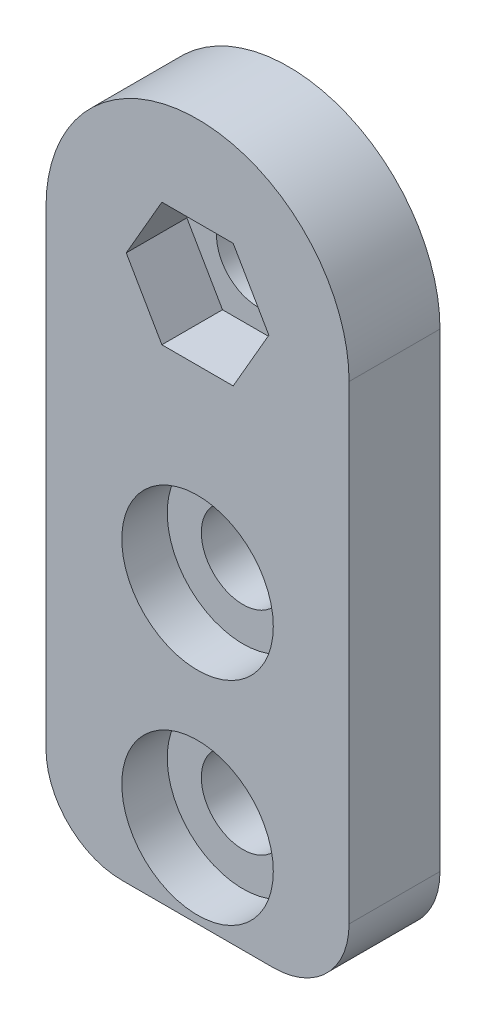
ISO-10303-21;
HEADER;
FILE_DESCRIPTION(('STEP AP214'),'2;1');
FILE_NAME('part.step','',(''),(''),'','','');
FILE_SCHEMA(('AUTOMOTIVE_DESIGN { 1 0 10303 214 1 1 1 1 }'));
ENDSEC;
DATA;
#1=APPLICATION_CONTEXT('core data for automotive mechanical design processes');
#2=APPLICATION_PROTOCOL_DEFINITION('international standard','automotive_design',2000,#1);
#3=PRODUCT_CONTEXT('',#1,'mechanical');
#4=PRODUCT('Part','Part','',(#3));
#5=PRODUCT_RELATED_PRODUCT_CATEGORY('part','',(#4));
#6=PRODUCT_DEFINITION_FORMATION('','',#4);
#7=PRODUCT_DEFINITION_CONTEXT('part definition',#1,'design');
#8=PRODUCT_DEFINITION('design','',#6,#7);
#9=PRODUCT_DEFINITION_SHAPE('','',#8);
#10=(LENGTH_UNIT() NAMED_UNIT(*) SI_UNIT(.MILLI.,.METRE.));
#11=(NAMED_UNIT(*) PLANE_ANGLE_UNIT() SI_UNIT($,.RADIAN.));
#12=(NAMED_UNIT(*) SI_UNIT($,.STERADIAN.) SOLID_ANGLE_UNIT());
#13=UNCERTAINTY_MEASURE_WITH_UNIT(LENGTH_MEASURE(1.E-05),#10,'distance_accuracy_value','');
#14=(GEOMETRIC_REPRESENTATION_CONTEXT(3) GLOBAL_UNCERTAINTY_ASSIGNED_CONTEXT((#13)) GLOBAL_UNIT_ASSIGNED_CONTEXT((#10,
#11,#12)) REPRESENTATION_CONTEXT('',''));
#15=CARTESIAN_POINT('',(0.,0.,0.));
#16=DIRECTION('',(0.,0.,1.));
#17=DIRECTION('',(1.,0.,0.));
#18=AXIS2_PLACEMENT_3D('',#15,#16,#17);
#19=CARTESIAN_POINT('',(0.,18.,6.));
#20=DIRECTION('',(0.,0.,-1.));
#21=DIRECTION('',(-1.,0.,0.));
#22=AXIS2_PLACEMENT_3D('',#19,#20,#21);
#23=CYLINDRICAL_SURFACE('',#22,2.75);
#24=CARTESIAN_POINT('',(0.,18.,0.));
#25=DIRECTION('',(0.,0.,1.));
#26=DIRECTION('',(1.,0.,0.));
#27=AXIS2_PLACEMENT_3D('',#24,#25,#26);
#28=CIRCLE('',#27,2.75);
#29=CARTESIAN_POINT('',(2.75,18.,0.));
#30=VERTEX_POINT('',#29);
#31=EDGE_CURVE('E191',#30,#30,#28,.T.);
#32=ORIENTED_EDGE('',*,*,#31,.F.);
#33=EDGE_LOOP('',(#32));
#34=FACE_BOUND('',#33,.T.);
#35=CARTESIAN_POINT('',(0.,18.,2.));
#36=DIRECTION('',(0.,0.,1.));
#37=DIRECTION('',(1.,0.,0.));
#38=AXIS2_PLACEMENT_3D('',#35,#36,#37);
#39=CIRCLE('',#38,2.75);
#40=CARTESIAN_POINT('',(2.75,18.,2.));
#41=VERTEX_POINT('',#40);
#42=EDGE_CURVE('E37',#41,#41,#39,.T.);
#43=ORIENTED_EDGE('',*,*,#42,.T.);
#44=EDGE_LOOP('',(#43));
#45=FACE_BOUND('',#44,.T.);
#46=ADVANCED_FACE('F33',(#34,#45),#23,.F.);
#47=CARTESIAN_POINT('',(0.,1.5,6.));
#48=DIRECTION('',(0.,0.,-1.));
#49=DIRECTION('',(-1.,0.,0.));
#50=AXIS2_PLACEMENT_3D('',#47,#48,#49);
#51=CYLINDRICAL_SURFACE('',#50,2.75);
#52=CARTESIAN_POINT('',(0.,1.5,0.));
#53=DIRECTION('',(0.,0.,1.));
#54=DIRECTION('',(1.,0.,0.));
#55=AXIS2_PLACEMENT_3D('',#52,#53,#54);
#56=CIRCLE('',#55,2.75);
#57=CARTESIAN_POINT('',(2.75,1.5,0.));
#58=VERTEX_POINT('',#57);
#59=EDGE_CURVE('E198',#58,#58,#56,.T.);
#60=ORIENTED_EDGE('',*,*,#59,.F.);
#61=EDGE_LOOP('',(#60));
#62=FACE_BOUND('',#61,.T.);
#63=CARTESIAN_POINT('',(0.,1.5,3.));
#64=DIRECTION('',(0.,0.,1.));
#65=DIRECTION('',(1.,0.,0.));
#66=AXIS2_PLACEMENT_3D('',#63,#64,#65);
#67=CIRCLE('',#66,2.75);
#68=CARTESIAN_POINT('',(2.75,1.5,3.));
#69=VERTEX_POINT('',#68);
#70=EDGE_CURVE('E195',#69,#69,#67,.T.);
#71=ORIENTED_EDGE('',*,*,#70,.T.);
#72=EDGE_LOOP('',(#71));
#73=FACE_BOUND('',#72,.T.);
#74=ADVANCED_FACE('F280',(#62,#73),#51,.F.);
#75=CARTESIAN_POINT('',(0.,-12.5,6.));
#76=DIRECTION('',(0.,0.,-1.));
#77=DIRECTION('',(-1.,0.,0.));
#78=AXIS2_PLACEMENT_3D('',#75,#76,#77);
#79=CYLINDRICAL_SURFACE('',#78,2.75);
#80=CARTESIAN_POINT('',(0.,-12.5,0.));
#81=DIRECTION('',(0.,0.,1.));
#82=DIRECTION('',(1.,0.,0.));
#83=AXIS2_PLACEMENT_3D('',#80,#81,#82);
#84=CIRCLE('',#83,2.75);
#85=CARTESIAN_POINT('',(2.75,-12.5,0.));
#86=VERTEX_POINT('',#85);
#87=EDGE_CURVE('E194',#86,#86,#84,.T.);
#88=ORIENTED_EDGE('',*,*,#87,.F.);
#89=EDGE_LOOP('',(#88));
#90=FACE_BOUND('',#89,.T.);
#91=CARTESIAN_POINT('',(0.,-12.5,3.));
#92=DIRECTION('',(0.,0.,1.));
#93=DIRECTION('',(1.,0.,0.));
#94=AXIS2_PLACEMENT_3D('',#91,#92,#93);
#95=CIRCLE('',#94,2.75);
#96=CARTESIAN_POINT('',(2.75,-12.5,3.));
#97=VERTEX_POINT('',#96);
#98=EDGE_CURVE('E181',#97,#97,#95,.T.);
#99=ORIENTED_EDGE('',*,*,#98,.T.);
#100=EDGE_LOOP('',(#99));
#101=FACE_BOUND('',#100,.T.);
#102=ADVANCED_FACE('F286',(#90,#101),#79,.F.);
#103=CARTESIAN_POINT('',(0.,18.,6.));
#104=DIRECTION('',(0.,0.,-1.));
#105=DIRECTION('',(-1.,0.,0.));
#106=AXIS2_PLACEMENT_3D('',#103,#104,#105);
#107=PLANE('',#106);
#108=DIRECTION('',(0.5,0.866025403784439,0.));
#109=VECTOR('',#108,1.);
#110=CARTESIAN_POINT('',(2.35270234694773,13.925,6.));
#111=LINE('',#110,#109);
#112=CARTESIAN_POINT('',(2.35270234694773,13.925,6.));
#113=VERTEX_POINT('',#112);
#114=CARTESIAN_POINT('',(4.70540469389545,18.,6.));
#115=VERTEX_POINT('',#114);
#116=EDGE_CURVE('E159',#113,#115,#111,.T.);
#117=ORIENTED_EDGE('',*,*,#116,.F.);
#118=DIRECTION('',(1.,0.,0.));
#119=VECTOR('',#118,1.);
#120=CARTESIAN_POINT('',(-2.35270234694773,13.925,6.));
#121=LINE('',#120,#119);
#122=CARTESIAN_POINT('',(-2.35270234694773,13.925,6.));
#123=VERTEX_POINT('',#122);
#124=EDGE_CURVE('E49',#123,#113,#121,.T.);
#125=ORIENTED_EDGE('',*,*,#124,.F.);
#126=DIRECTION('',(0.499999999999999,-0.866025403784439,0.));
#127=VECTOR('',#126,1.);
#128=CARTESIAN_POINT('',(-4.70540469389546,18.,6.));
#129=LINE('',#128,#127);
#130=CARTESIAN_POINT('',(-4.70540469389546,18.,6.));
#131=VERTEX_POINT('',#130);
#132=EDGE_CURVE('E145',#131,#123,#129,.T.);
#133=ORIENTED_EDGE('',*,*,#132,.F.);
#134=DIRECTION('',(-0.5,-0.866025403784438,0.));
#135=VECTOR('',#134,1.);
#136=CARTESIAN_POINT('',(-2.35270234694773,22.075,6.));
#137=LINE('',#136,#135);
#138=CARTESIAN_POINT('',(-2.35270234694773,22.075,6.));
#139=VERTEX_POINT('',#138);
#140=EDGE_CURVE('E148',#139,#131,#137,.T.);
#141=ORIENTED_EDGE('',*,*,#140,.F.);
#142=DIRECTION('',(-1.,0.,0.));
#143=VECTOR('',#142,1.);
#144=CARTESIAN_POINT('',(2.35270234694773,22.075,6.));
#145=LINE('',#144,#143);
#146=CARTESIAN_POINT('',(2.35270234694773,22.075,6.));
#147=VERTEX_POINT('',#146);
#148=EDGE_CURVE('E164',#147,#139,#145,.T.);
#149=ORIENTED_EDGE('',*,*,#148,.F.);
#150=DIRECTION('',(-0.5,0.866025403784439,0.));
#151=VECTOR('',#150,1.);
#152=CARTESIAN_POINT('',(4.70540469389545,18.,6.));
#153=LINE('',#152,#151);
#154=EDGE_CURVE('E161',#115,#147,#153,.T.);
#155=ORIENTED_EDGE('',*,*,#154,.F.);
#156=EDGE_LOOP('',(#117,#125,#133,#141,#149,#155));
#157=FACE_BOUND('',#156,.T.);
#158=CARTESIAN_POINT('',(0.,1.5,6.));
#159=DIRECTION('',(0.,0.,1.));
#160=DIRECTION('',(1.,0.,0.));
#161=AXIS2_PLACEMENT_3D('',#158,#159,#160);
#162=CIRCLE('',#161,5.);
#163=CARTESIAN_POINT('',(5.,1.5,6.));
#164=VERTEX_POINT('',#163);
#165=EDGE_CURVE('E182',#164,#164,#162,.T.);
#166=ORIENTED_EDGE('',*,*,#165,.F.);
#167=EDGE_LOOP('',(#166));
#168=FACE_BOUND('',#167,.T.);
#169=CARTESIAN_POINT('',(0.,-12.5,6.));
#170=DIRECTION('',(0.,0.,1.));
#171=DIRECTION('',(1.,0.,0.));
#172=AXIS2_PLACEMENT_3D('',#169,#170,#171);
#173=CIRCLE('',#172,5.);
#174=CARTESIAN_POINT('',(5.,-12.5,6.));
#175=VERTEX_POINT('',#174);
#176=EDGE_CURVE('E188',#175,#175,#173,.T.);
#177=ORIENTED_EDGE('',*,*,#176,.F.);
#178=EDGE_LOOP('',(#177));
#179=FACE_BOUND('',#178,.T.);
#180=DIRECTION('',(0.,-1.,0.));
#181=VECTOR('',#180,1.);
#182=CARTESIAN_POINT('',(-10.,18.,6.));
#183=LINE('',#182,#181);
#184=CARTESIAN_POINT('',(-10.,18.,6.));
#185=VERTEX_POINT('',#184);
#186=CARTESIAN_POINT('',(-9.99999999999999,-13.,6.));
#187=VERTEX_POINT('',#186);
#188=EDGE_CURVE('E202',#185,#187,#183,.T.);
#189=ORIENTED_EDGE('',*,*,#188,.T.);
#190=CARTESIAN_POINT('',(-4.99999999999999,-13.,6.));
#191=DIRECTION('',(0.,0.,-1.));
#192=DIRECTION('',(-1.,0.,0.));
#193=AXIS2_PLACEMENT_3D('',#190,#191,#192);
#194=CIRCLE('',#193,5.);
#195=CARTESIAN_POINT('',(-4.99999999999999,-18.,6.));
#196=VERTEX_POINT('',#195);
#197=EDGE_CURVE('E42',#187,#196,#194,.F.);
#198=ORIENTED_EDGE('',*,*,#197,.T.);
#199=DIRECTION('',(1.,0.,0.));
#200=VECTOR('',#199,1.);
#201=CARTESIAN_POINT('',(10.,-18.,6.));
#202=LINE('',#201,#200);
#203=CARTESIAN_POINT('',(5.,-18.,6.));
#204=VERTEX_POINT('',#203);
#205=EDGE_CURVE('E205',#196,#204,#202,.T.);
#206=ORIENTED_EDGE('',*,*,#205,.T.);
#207=CARTESIAN_POINT('',(5.,-13.,6.));
#208=DIRECTION('',(0.,0.,-1.));
#209=DIRECTION('',(-1.,0.,0.));
#210=AXIS2_PLACEMENT_3D('',#207,#208,#209);
#211=CIRCLE('',#210,5.);
#212=CARTESIAN_POINT('',(10.,-13.,6.));
#213=VERTEX_POINT('',#212);
#214=EDGE_CURVE('E57',#204,#213,#211,.F.);
#215=ORIENTED_EDGE('',*,*,#214,.T.);
#216=DIRECTION('',(0.,1.,0.));
#217=VECTOR('',#216,1.);
#218=CARTESIAN_POINT('',(10.,18.,6.));
#219=LINE('',#218,#217);
#220=CARTESIAN_POINT('',(10.,18.,6.));
#221=VERTEX_POINT('',#220);
#222=EDGE_CURVE('E208',#213,#221,#219,.T.);
#223=ORIENTED_EDGE('',*,*,#222,.T.);
#224=CARTESIAN_POINT('',(0.,18.,6.));
#225=DIRECTION('',(0.,0.,1.));
#226=DIRECTION('',(-1.,0.,0.));
#227=AXIS2_PLACEMENT_3D('',#224,#225,#226);
#228=CIRCLE('',#227,10.);
#229=EDGE_CURVE('E210',#221,#185,#228,.T.);
#230=ORIENTED_EDGE('',*,*,#229,.T.);
#231=EDGE_LOOP('',(#189,#198,#206,#215,#223,#230));
#232=FACE_BOUND('',#231,.T.);
#233=ADVANCED_FACE('F244',(#157,#168,#179,#232),#107,.F.);
#234=CARTESIAN_POINT('',(0.,18.,0.));
#235=DIRECTION('',(0.,0.,-1.));
#236=DIRECTION('',(-1.,0.,0.));
#237=AXIS2_PLACEMENT_3D('',#234,#235,#236);
#238=PLANE('',#237);
#239=ORIENTED_EDGE('',*,*,#87,.T.);
#240=EDGE_LOOP('',(#239));
#241=FACE_BOUND('',#240,.T.);
#242=DIRECTION('',(1.,0.,0.));
#243=VECTOR('',#242,1.);
#244=CARTESIAN_POINT('',(10.,-18.,0.));
#245=LINE('',#244,#243);
#246=CARTESIAN_POINT('',(-4.99999999999999,-18.,0.));
#247=VERTEX_POINT('',#246);
#248=CARTESIAN_POINT('',(5.,-18.,0.));
#249=VERTEX_POINT('',#248);
#250=EDGE_CURVE('E215',#247,#249,#245,.T.);
#251=ORIENTED_EDGE('',*,*,#250,.F.);
#252=CARTESIAN_POINT('',(-4.99999999999999,-13.,0.));
#253=DIRECTION('',(0.,0.,-1.));
#254=DIRECTION('',(-1.,0.,0.));
#255=AXIS2_PLACEMENT_3D('',#252,#253,#254);
#256=CIRCLE('',#255,5.);
#257=CARTESIAN_POINT('',(-9.99999999999999,-13.,0.));
#258=VERTEX_POINT('',#257);
#259=EDGE_CURVE('E237',#247,#258,#256,.T.);
#260=ORIENTED_EDGE('',*,*,#259,.T.);
#261=DIRECTION('',(0.,-1.,0.));
#262=VECTOR('',#261,1.);
#263=CARTESIAN_POINT('',(-10.,18.,0.));
#264=LINE('',#263,#262);
#265=CARTESIAN_POINT('',(-10.,18.,0.));
#266=VERTEX_POINT('',#265);
#267=EDGE_CURVE('E201',#266,#258,#264,.T.);
#268=ORIENTED_EDGE('',*,*,#267,.F.);
#269=CARTESIAN_POINT('',(0.,18.,0.));
#270=DIRECTION('',(0.,0.,1.));
#271=DIRECTION('',(-1.,0.,0.));
#272=AXIS2_PLACEMENT_3D('',#269,#270,#271);
#273=CIRCLE('',#272,10.);
#274=CARTESIAN_POINT('',(10.,18.,0.));
#275=VERTEX_POINT('',#274);
#276=EDGE_CURVE('E206',#275,#266,#273,.T.);
#277=ORIENTED_EDGE('',*,*,#276,.F.);
#278=DIRECTION('',(0.,1.,0.));
#279=VECTOR('',#278,1.);
#280=CARTESIAN_POINT('',(10.,18.,0.));
#281=LINE('',#280,#279);
#282=CARTESIAN_POINT('',(10.,-13.,0.));
#283=VERTEX_POINT('',#282);
#284=EDGE_CURVE('E218',#283,#275,#281,.T.);
#285=ORIENTED_EDGE('',*,*,#284,.F.);
#286=CARTESIAN_POINT('',(5.,-13.,0.));
#287=DIRECTION('',(0.,0.,-1.));
#288=DIRECTION('',(-1.,0.,0.));
#289=AXIS2_PLACEMENT_3D('',#286,#287,#288);
#290=CIRCLE('',#289,5.);
#291=EDGE_CURVE('E235',#283,#249,#290,.T.);
#292=ORIENTED_EDGE('',*,*,#291,.T.);
#293=EDGE_LOOP('',(#251,#260,#268,#277,#285,#292));
#294=FACE_BOUND('',#293,.T.);
#295=ORIENTED_EDGE('',*,*,#59,.T.);
#296=EDGE_LOOP('',(#295));
#297=FACE_BOUND('',#296,.T.);
#298=ORIENTED_EDGE('',*,*,#31,.T.);
#299=EDGE_LOOP('',(#298));
#300=FACE_BOUND('',#299,.T.);
#301=ADVANCED_FACE('F256',(#241,#294,#297,#300),#238,.T.);
#302=CARTESIAN_POINT('',(-10.,18.,6.));
#303=DIRECTION('',(1.,0.,0.));
#304=DIRECTION('',(0.,1.,0.));
#305=AXIS2_PLACEMENT_3D('',#302,#303,#304);
#306=PLANE('',#305);
#307=ORIENTED_EDGE('',*,*,#267,.T.);
#308=DIRECTION('',(0.,0.,-1.));
#309=VECTOR('',#308,1.);
#310=CARTESIAN_POINT('',(-9.99999999999999,-13.,6.));
#311=LINE('',#310,#309);
#312=EDGE_CURVE('E239',#258,#187,#311,.F.);
#313=ORIENTED_EDGE('',*,*,#312,.T.);
#314=ORIENTED_EDGE('',*,*,#188,.F.);
#315=DIRECTION('',(0.,0.,-1.));
#316=VECTOR('',#315,1.);
#317=CARTESIAN_POINT('',(-10.,18.,6.));
#318=LINE('',#317,#316);
#319=EDGE_CURVE('E212',#185,#266,#318,.T.);
#320=ORIENTED_EDGE('',*,*,#319,.T.);
#321=EDGE_LOOP('',(#307,#313,#314,#320));
#322=FACE_BOUND('',#321,.T.);
#323=ADVANCED_FACE('F260',(#322),#306,.F.);
#324=CARTESIAN_POINT('',(10.,-18.,6.));
#325=DIRECTION('',(0.,1.,0.));
#326=DIRECTION('',(0.,0.,1.));
#327=AXIS2_PLACEMENT_3D('',#324,#325,#326);
#328=PLANE('',#327);
#329=ORIENTED_EDGE('',*,*,#205,.F.);
#330=DIRECTION('',(0.,0.,-1.));
#331=VECTOR('',#330,1.);
#332=CARTESIAN_POINT('',(-4.99999999999999,-18.,6.));
#333=LINE('',#332,#331);
#334=EDGE_CURVE('E232',#196,#247,#333,.T.);
#335=ORIENTED_EDGE('',*,*,#334,.T.);
#336=ORIENTED_EDGE('',*,*,#250,.T.);
#337=DIRECTION('',(0.,0.,-1.));
#338=VECTOR('',#337,1.);
#339=CARTESIAN_POINT('',(5.,-18.,6.));
#340=LINE('',#339,#338);
#341=EDGE_CURVE('E226',#249,#204,#340,.F.);
#342=ORIENTED_EDGE('',*,*,#341,.T.);
#343=EDGE_LOOP('',(#329,#335,#336,#342));
#344=FACE_BOUND('',#343,.T.);
#345=ADVANCED_FACE('F250',(#344),#328,.F.);
#346=CARTESIAN_POINT('',(10.,18.,6.));
#347=DIRECTION('',(-1.,0.,0.));
#348=DIRECTION('',(0.,-1.,0.));
#349=AXIS2_PLACEMENT_3D('',#346,#347,#348);
#350=PLANE('',#349);
#351=ORIENTED_EDGE('',*,*,#222,.F.);
#352=DIRECTION('',(0.,0.,-1.));
#353=VECTOR('',#352,1.);
#354=CARTESIAN_POINT('',(10.,-13.,6.));
#355=LINE('',#354,#353);
#356=EDGE_CURVE('E11',#213,#283,#355,.T.);
#357=ORIENTED_EDGE('',*,*,#356,.T.);
#358=ORIENTED_EDGE('',*,*,#284,.T.);
#359=DIRECTION('',(0.,0.,-1.));
#360=VECTOR('',#359,1.);
#361=CARTESIAN_POINT('',(10.,18.,6.));
#362=LINE('',#361,#360);
#363=EDGE_CURVE('E223',#221,#275,#362,.T.);
#364=ORIENTED_EDGE('',*,*,#363,.F.);
#365=EDGE_LOOP('',(#351,#357,#358,#364));
#366=FACE_BOUND('',#365,.T.);
#367=ADVANCED_FACE('F268',(#366),#350,.F.);
#368=CARTESIAN_POINT('',(0.,18.,6.));
#369=DIRECTION('',(0.,0.,-1.));
#370=DIRECTION('',(-1.,0.,0.));
#371=AXIS2_PLACEMENT_3D('',#368,#369,#370);
#372=CYLINDRICAL_SURFACE('',#371,10.);
#373=ORIENTED_EDGE('',*,*,#276,.T.);
#374=ORIENTED_EDGE('',*,*,#319,.F.);
#375=ORIENTED_EDGE('',*,*,#229,.F.);
#376=ORIENTED_EDGE('',*,*,#363,.T.);
#377=EDGE_LOOP('',(#373,#374,#375,#376));
#378=FACE_BOUND('',#377,.T.);
#379=ADVANCED_FACE('F264',(#378),#372,.T.);
#380=CARTESIAN_POINT('',(0.,-12.5,3.));
#381=DIRECTION('',(0.,0.,1.));
#382=DIRECTION('',(1.,0.,0.));
#383=AXIS2_PLACEMENT_3D('',#380,#381,#382);
#384=CYLINDRICAL_SURFACE('',#383,5.);
#385=CARTESIAN_POINT('',(0.,-12.5,3.));
#386=DIRECTION('',(0.,0.,1.));
#387=DIRECTION('',(1.,0.,0.));
#388=AXIS2_PLACEMENT_3D('',#385,#386,#387);
#389=CIRCLE('',#388,5.);
#390=CARTESIAN_POINT('',(5.,-12.5,3.));
#391=VERTEX_POINT('',#390);
#392=EDGE_CURVE('E185',#391,#391,#389,.T.);
#393=ORIENTED_EDGE('',*,*,#392,.F.);
#394=EDGE_LOOP('',(#393));
#395=FACE_BOUND('',#394,.T.);
#396=ORIENTED_EDGE('',*,*,#176,.T.);
#397=EDGE_LOOP('',(#396));
#398=FACE_BOUND('',#397,.T.);
#399=ADVANCED_FACE('F293',(#395,#398),#384,.F.);
#400=CARTESIAN_POINT('',(0.,-12.5,3.));
#401=DIRECTION('',(0.,0.,1.));
#402=DIRECTION('',(1.,0.,0.));
#403=AXIS2_PLACEMENT_3D('',#400,#401,#402);
#404=PLANE('',#403);
#405=ORIENTED_EDGE('',*,*,#98,.F.);
#406=EDGE_LOOP('',(#405));
#407=FACE_BOUND('',#406,.T.);
#408=ORIENTED_EDGE('',*,*,#392,.T.);
#409=EDGE_LOOP('',(#408));
#410=FACE_BOUND('',#409,.T.);
#411=ADVANCED_FACE('F335',(#407,#410),#404,.T.);
#412=CARTESIAN_POINT('',(0.,1.5,3.));
#413=DIRECTION('',(0.,0.,1.));
#414=DIRECTION('',(1.,0.,0.));
#415=AXIS2_PLACEMENT_3D('',#412,#413,#414);
#416=CYLINDRICAL_SURFACE('',#415,5.);
#417=CARTESIAN_POINT('',(0.,1.5,3.));
#418=DIRECTION('',(0.,0.,1.));
#419=DIRECTION('',(1.,0.,0.));
#420=AXIS2_PLACEMENT_3D('',#417,#418,#419);
#421=CIRCLE('',#420,5.);
#422=CARTESIAN_POINT('',(5.,1.5,3.));
#423=VERTEX_POINT('',#422);
#424=EDGE_CURVE('E178',#423,#423,#421,.T.);
#425=ORIENTED_EDGE('',*,*,#424,.F.);
#426=EDGE_LOOP('',(#425));
#427=FACE_BOUND('',#426,.T.);
#428=ORIENTED_EDGE('',*,*,#165,.T.);
#429=EDGE_LOOP('',(#428));
#430=FACE_BOUND('',#429,.T.);
#431=ADVANCED_FACE('F343',(#427,#430),#416,.F.);
#432=CARTESIAN_POINT('',(0.,1.5,3.));
#433=DIRECTION('',(0.,0.,1.));
#434=DIRECTION('',(1.,0.,0.));
#435=AXIS2_PLACEMENT_3D('',#432,#433,#434);
#436=PLANE('',#435);
#437=ORIENTED_EDGE('',*,*,#70,.F.);
#438=EDGE_LOOP('',(#437));
#439=FACE_BOUND('',#438,.T.);
#440=ORIENTED_EDGE('',*,*,#424,.T.);
#441=EDGE_LOOP('',(#440));
#442=FACE_BOUND('',#441,.T.);
#443=ADVANCED_FACE('F278',(#439,#442),#436,.T.);
#444=CARTESIAN_POINT('',(-4.99999999999999,-13.,6.));
#445=DIRECTION('',(0.,0.,-1.));
#446=DIRECTION('',(-1.,0.,0.));
#447=AXIS2_PLACEMENT_3D('',#444,#445,#446);
#448=CYLINDRICAL_SURFACE('',#447,5.);
#449=ORIENTED_EDGE('',*,*,#197,.F.);
#450=ORIENTED_EDGE('',*,*,#312,.F.);
#451=ORIENTED_EDGE('',*,*,#259,.F.);
#452=ORIENTED_EDGE('',*,*,#334,.F.);
#453=EDGE_LOOP('',(#449,#450,#451,#452));
#454=FACE_BOUND('',#453,.T.);
#455=ADVANCED_FACE('F253',(#454),#448,.T.);
#456=CARTESIAN_POINT('',(5.,-13.,6.));
#457=DIRECTION('',(0.,0.,-1.));
#458=DIRECTION('',(-1.,0.,0.));
#459=AXIS2_PLACEMENT_3D('',#456,#457,#458);
#460=CYLINDRICAL_SURFACE('',#459,5.);
#461=ORIENTED_EDGE('',*,*,#214,.F.);
#462=ORIENTED_EDGE('',*,*,#341,.F.);
#463=ORIENTED_EDGE('',*,*,#291,.F.);
#464=ORIENTED_EDGE('',*,*,#356,.F.);
#465=EDGE_LOOP('',(#461,#462,#463,#464));
#466=FACE_BOUND('',#465,.T.);
#467=ADVANCED_FACE('F35',(#466),#460,.T.);
#468=CARTESIAN_POINT('',(-2.35270234694773,13.925,2.));
#469=DIRECTION('',(0.,-1.,0.));
#470=DIRECTION('',(1.,0.,0.));
#471=AXIS2_PLACEMENT_3D('',#468,#469,#470);
#472=PLANE('',#471);
#473=ORIENTED_EDGE('',*,*,#124,.T.);
#474=DIRECTION('',(0.,0.,1.));
#475=VECTOR('',#474,1.);
#476=CARTESIAN_POINT('',(2.35270234694773,13.925,2.));
#477=LINE('',#476,#475);
#478=CARTESIAN_POINT('',(2.35270234694773,13.925,2.));
#479=VERTEX_POINT('',#478);
#480=EDGE_CURVE('E122',#479,#113,#477,.T.);
#481=ORIENTED_EDGE('',*,*,#480,.F.);
#482=DIRECTION('',(1.,0.,0.));
#483=VECTOR('',#482,1.);
#484=CARTESIAN_POINT('',(-2.35270234694773,13.925,2.));
#485=LINE('',#484,#483);
#486=CARTESIAN_POINT('',(-2.35270234694773,13.925,2.));
#487=VERTEX_POINT('',#486);
#488=EDGE_CURVE('E126',#487,#479,#485,.T.);
#489=ORIENTED_EDGE('',*,*,#488,.F.);
#490=DIRECTION('',(0.,0.,1.));
#491=VECTOR('',#490,1.);
#492=CARTESIAN_POINT('',(-2.35270234694773,13.925,2.));
#493=LINE('',#492,#491);
#494=EDGE_CURVE('E169',#487,#123,#493,.T.);
#495=ORIENTED_EDGE('',*,*,#494,.T.);
#496=EDGE_LOOP('',(#473,#481,#489,#495));
#497=FACE_BOUND('',#496,.T.);
#498=ADVANCED_FACE('F124',(#497),#472,.F.);
#499=CARTESIAN_POINT('',(-4.70540469389546,18.,2.));
#500=DIRECTION('',(-0.866025403784439,-0.499999999999999,0.));
#501=DIRECTION('',(0.499999999999999,-0.866025403784439,0.));
#502=AXIS2_PLACEMENT_3D('',#499,#500,#501);
#503=PLANE('',#502);
#504=ORIENTED_EDGE('',*,*,#132,.T.);
#505=ORIENTED_EDGE('',*,*,#494,.F.);
#506=DIRECTION('',(0.499999999999999,-0.866025403784439,0.));
#507=VECTOR('',#506,1.);
#508=CARTESIAN_POINT('',(-4.70540469389546,18.,2.));
#509=LINE('',#508,#507);
#510=CARTESIAN_POINT('',(-4.70540469389546,18.,2.));
#511=VERTEX_POINT('',#510);
#512=EDGE_CURVE('E132',#511,#487,#509,.T.);
#513=ORIENTED_EDGE('',*,*,#512,.F.);
#514=DIRECTION('',(0.,0.,1.));
#515=VECTOR('',#514,1.);
#516=CARTESIAN_POINT('',(-4.70540469389546,18.,2.));
#517=LINE('',#516,#515);
#518=EDGE_CURVE('E171',#511,#131,#517,.T.);
#519=ORIENTED_EDGE('',*,*,#518,.T.);
#520=EDGE_LOOP('',(#504,#505,#513,#519));
#521=FACE_BOUND('',#520,.T.);
#522=ADVANCED_FACE('F276',(#521),#503,.F.);
#523=CARTESIAN_POINT('',(-2.35270234694773,22.075,2.));
#524=DIRECTION('',(-0.866025403784438,0.5,0.));
#525=DIRECTION('',(-0.5,-0.866025403784438,0.));
#526=AXIS2_PLACEMENT_3D('',#523,#524,#525);
#527=PLANE('',#526);
#528=ORIENTED_EDGE('',*,*,#140,.T.);
#529=ORIENTED_EDGE('',*,*,#518,.F.);
#530=DIRECTION('',(-0.5,-0.866025403784438,0.));
#531=VECTOR('',#530,1.);
#532=CARTESIAN_POINT('',(-2.35270234694773,22.075,2.));
#533=LINE('',#532,#531);
#534=CARTESIAN_POINT('',(-2.35270234694773,22.075,2.));
#535=VERTEX_POINT('',#534);
#536=EDGE_CURVE('E155',#535,#511,#533,.T.);
#537=ORIENTED_EDGE('',*,*,#536,.F.);
#538=DIRECTION('',(0.,0.,1.));
#539=VECTOR('',#538,1.);
#540=CARTESIAN_POINT('',(-2.35270234694773,22.075,2.));
#541=LINE('',#540,#539);
#542=EDGE_CURVE('E173',#535,#139,#541,.T.);
#543=ORIENTED_EDGE('',*,*,#542,.T.);
#544=EDGE_LOOP('',(#528,#529,#537,#543));
#545=FACE_BOUND('',#544,.T.);
#546=ADVANCED_FACE('F391',(#545),#527,.F.);
#547=CARTESIAN_POINT('',(2.35270234694773,22.075,2.));
#548=DIRECTION('',(0.,1.,0.));
#549=DIRECTION('',(0.,0.,1.));
#550=AXIS2_PLACEMENT_3D('',#547,#548,#549);
#551=PLANE('',#550);
#552=ORIENTED_EDGE('',*,*,#148,.T.);
#553=ORIENTED_EDGE('',*,*,#542,.F.);
#554=DIRECTION('',(-1.,0.,0.));
#555=VECTOR('',#554,1.);
#556=CARTESIAN_POINT('',(2.35270234694773,22.075,2.));
#557=LINE('',#556,#555);
#558=CARTESIAN_POINT('',(2.35270234694773,22.075,2.));
#559=VERTEX_POINT('',#558);
#560=EDGE_CURVE('E152',#559,#535,#557,.T.);
#561=ORIENTED_EDGE('',*,*,#560,.F.);
#562=DIRECTION('',(0.,0.,1.));
#563=VECTOR('',#562,1.);
#564=CARTESIAN_POINT('',(2.35270234694773,22.075,2.));
#565=LINE('',#564,#563);
#566=EDGE_CURVE('E175',#559,#147,#565,.T.);
#567=ORIENTED_EDGE('',*,*,#566,.T.);
#568=EDGE_LOOP('',(#552,#553,#561,#567));
#569=FACE_BOUND('',#568,.T.);
#570=ADVANCED_FACE('F401',(#569),#551,.F.);
#571=CARTESIAN_POINT('',(4.70540469389545,18.,2.));
#572=DIRECTION('',(0.866025403784439,0.5,0.));
#573=DIRECTION('',(-0.5,0.866025403784439,0.));
#574=AXIS2_PLACEMENT_3D('',#571,#572,#573);
#575=PLANE('',#574);
#576=ORIENTED_EDGE('',*,*,#154,.T.);
#577=ORIENTED_EDGE('',*,*,#566,.F.);
#578=DIRECTION('',(-0.5,0.866025403784439,0.));
#579=VECTOR('',#578,1.);
#580=CARTESIAN_POINT('',(4.70540469389545,18.,2.));
#581=LINE('',#580,#579);
#582=CARTESIAN_POINT('',(4.70540469389545,18.,2.));
#583=VERTEX_POINT('',#582);
#584=EDGE_CURVE('E140',#583,#559,#581,.T.);
#585=ORIENTED_EDGE('',*,*,#584,.F.);
#586=DIRECTION('',(0.,0.,1.));
#587=VECTOR('',#586,1.);
#588=CARTESIAN_POINT('',(4.70540469389545,18.,2.));
#589=LINE('',#588,#587);
#590=EDGE_CURVE('E131',#583,#115,#589,.T.);
#591=ORIENTED_EDGE('',*,*,#590,.T.);
#592=EDGE_LOOP('',(#576,#577,#585,#591));
#593=FACE_BOUND('',#592,.T.);
#594=ADVANCED_FACE('F411',(#593),#575,.F.);
#595=CARTESIAN_POINT('',(2.35270234694773,13.925,2.));
#596=DIRECTION('',(0.866025403784439,-0.5,0.));
#597=DIRECTION('',(0.5,0.866025403784439,0.));
#598=AXIS2_PLACEMENT_3D('',#595,#596,#597);
#599=PLANE('',#598);
#600=ORIENTED_EDGE('',*,*,#116,.T.);
#601=ORIENTED_EDGE('',*,*,#590,.F.);
#602=DIRECTION('',(0.5,0.866025403784439,0.));
#603=VECTOR('',#602,1.);
#604=CARTESIAN_POINT('',(2.35270234694773,13.925,2.));
#605=LINE('',#604,#603);
#606=EDGE_CURVE('E135',#479,#583,#605,.T.);
#607=ORIENTED_EDGE('',*,*,#606,.F.);
#608=ORIENTED_EDGE('',*,*,#480,.T.);
#609=EDGE_LOOP('',(#600,#601,#607,#608));
#610=FACE_BOUND('',#609,.T.);
#611=ADVANCED_FACE('F136',(#610),#599,.F.);
#612=CARTESIAN_POINT('',(0.,0.,2.));
#613=DIRECTION('',(0.,0.,1.));
#614=DIRECTION('',(1.,0.,0.));
#615=AXIS2_PLACEMENT_3D('',#612,#613,#614);
#616=PLANE('',#615);
#617=ORIENTED_EDGE('',*,*,#42,.F.);
#618=EDGE_LOOP('',(#617));
#619=FACE_BOUND('',#618,.T.);
#620=ORIENTED_EDGE('',*,*,#488,.T.);
#621=ORIENTED_EDGE('',*,*,#606,.T.);
#622=ORIENTED_EDGE('',*,*,#584,.T.);
#623=ORIENTED_EDGE('',*,*,#560,.T.);
#624=ORIENTED_EDGE('',*,*,#536,.T.);
#625=ORIENTED_EDGE('',*,*,#512,.T.);
#626=EDGE_LOOP('',(#620,#621,#622,#623,#624,#625));
#627=FACE_BOUND('',#626,.T.);
#628=ADVANCED_FACE('F142',(#619,#627),#616,.T.);
#629=CLOSED_SHELL('',(#46,#74,#102,#233,#301,#323,#345,#367,#379,#399,#411,#431,#443,#455,#467,
#498,#522,#546,#570,#594,#611,#628));
#630=MANIFOLD_SOLID_BREP('B2',#629);
#631=ADVANCED_BREP_SHAPE_REPRESENTATION('',(#18,#630),#14);
#632=SHAPE_DEFINITION_REPRESENTATION(#9,#631);
ENDSEC;
END-ISO-10303-21;
